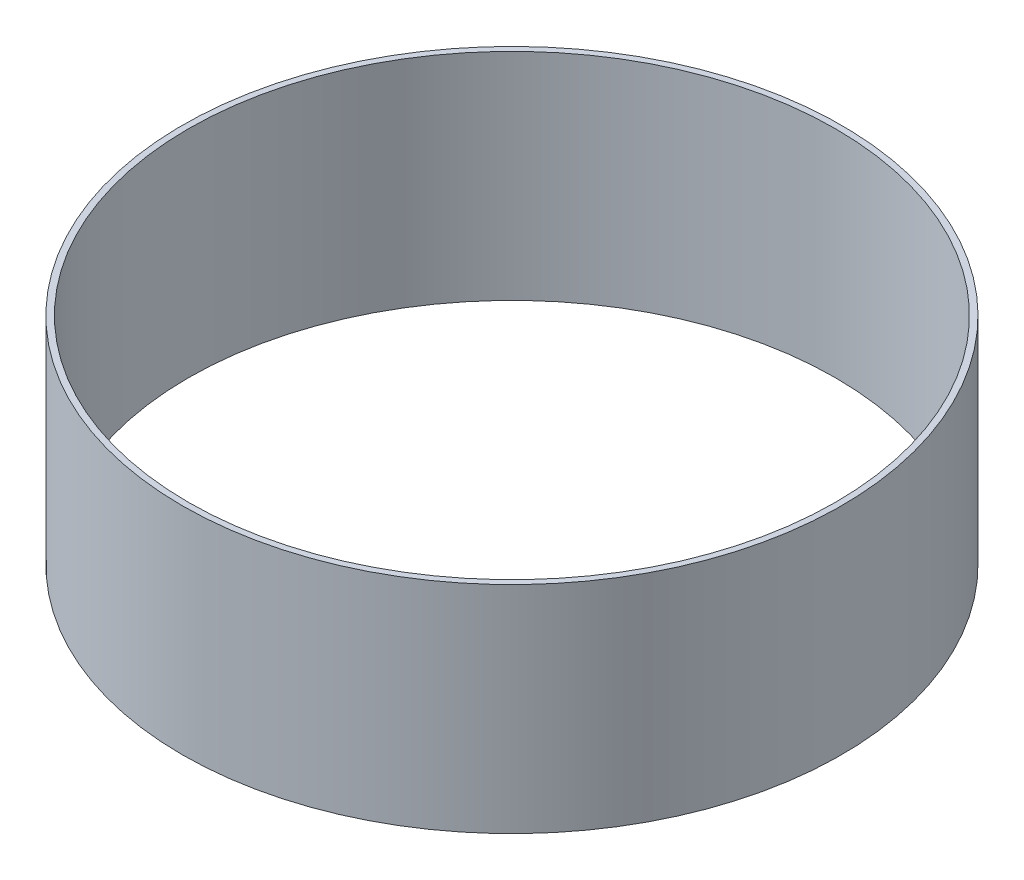
ISO-10303-21;
HEADER;
FILE_DESCRIPTION(('STEP AP214'),'2;1');
FILE_NAME('part.step','',(''),(''),'','','');
FILE_SCHEMA(('AUTOMOTIVE_DESIGN { 1 0 10303 214 1 1 1 1 }'));
ENDSEC;
DATA;
#1=APPLICATION_CONTEXT('core data for automotive mechanical design processes');
#2=APPLICATION_PROTOCOL_DEFINITION('international standard','automotive_design',2000,#1);
#3=PRODUCT_CONTEXT('',#1,'mechanical');
#4=PRODUCT('Part','Part','',(#3));
#5=PRODUCT_RELATED_PRODUCT_CATEGORY('part','',(#4));
#6=PRODUCT_DEFINITION_FORMATION('','',#4);
#7=PRODUCT_DEFINITION_CONTEXT('part definition',#1,'design');
#8=PRODUCT_DEFINITION('design','',#6,#7);
#9=PRODUCT_DEFINITION_SHAPE('','',#8);
#10=(LENGTH_UNIT() NAMED_UNIT(*) SI_UNIT(.MILLI.,.METRE.));
#11=(NAMED_UNIT(*) PLANE_ANGLE_UNIT() SI_UNIT($,.RADIAN.));
#12=(NAMED_UNIT(*) SI_UNIT($,.STERADIAN.) SOLID_ANGLE_UNIT());
#13=UNCERTAINTY_MEASURE_WITH_UNIT(LENGTH_MEASURE(1.E-05),#10,'distance_accuracy_value','');
#14=(GEOMETRIC_REPRESENTATION_CONTEXT(3) GLOBAL_UNCERTAINTY_ASSIGNED_CONTEXT((#13)) GLOBAL_UNIT_ASSIGNED_CONTEXT((#10,
#11,#12)) REPRESENTATION_CONTEXT('',''));
#15=CARTESIAN_POINT('',(0.,0.,0.));
#16=DIRECTION('',(0.,0.,1.));
#17=DIRECTION('',(1.,0.,0.));
#18=AXIS2_PLACEMENT_3D('',#15,#16,#17);
#19=CARTESIAN_POINT('',(0.,25.4,0.));
#20=DIRECTION('',(0.,1.,0.));
#21=DIRECTION('',(0.,0.,1.));
#22=AXIS2_PLACEMENT_3D('',#19,#20,#21);
#23=PLANE('',#22);
#24=CARTESIAN_POINT('',(0.,25.4,0.));
#25=DIRECTION('',(0.,1.,0.));
#26=DIRECTION('',(0.,0.,1.));
#27=AXIS2_PLACEMENT_3D('',#24,#25,#26);
#28=CIRCLE('',#27,77.6224);
#29=CARTESIAN_POINT('',(0.,25.4,77.6224));
#30=VERTEX_POINT('',#29);
#31=EDGE_CURVE('E10',#30,#30,#28,.T.);
#32=ORIENTED_EDGE('',*,*,#31,.T.);
#33=EDGE_LOOP('',(#32));
#34=FACE_BOUND('',#33,.T.);
#35=CARTESIAN_POINT('',(0.,25.4,0.));
#36=DIRECTION('',(0.,1.,0.));
#37=DIRECTION('',(0.,0.,1.));
#38=AXIS2_PLACEMENT_3D('',#35,#36,#37);
#39=CIRCLE('',#38,76.2);
#40=CARTESIAN_POINT('',(0.,25.4,76.2));
#41=VERTEX_POINT('',#40);
#42=EDGE_CURVE('E46',#41,#41,#39,.T.);
#43=ORIENTED_EDGE('',*,*,#42,.F.);
#44=EDGE_LOOP('',(#43));
#45=FACE_BOUND('',#44,.T.);
#46=ADVANCED_FACE('F35',(#34,#45),#23,.T.);
#47=CARTESIAN_POINT('',(0.,-25.4,0.));
#48=DIRECTION('',(0.,1.,0.));
#49=DIRECTION('',(0.,0.,1.));
#50=AXIS2_PLACEMENT_3D('',#47,#48,#49);
#51=PLANE('',#50);
#52=CARTESIAN_POINT('',(0.,-25.4,0.));
#53=DIRECTION('',(0.,1.,0.));
#54=DIRECTION('',(0.,0.,1.));
#55=AXIS2_PLACEMENT_3D('',#52,#53,#54);
#56=CIRCLE('',#55,77.6224);
#57=CARTESIAN_POINT('',(0.,-25.4,77.6224));
#58=VERTEX_POINT('',#57);
#59=EDGE_CURVE('E39',#58,#58,#56,.T.);
#60=ORIENTED_EDGE('',*,*,#59,.F.);
#61=EDGE_LOOP('',(#60));
#62=FACE_BOUND('',#61,.T.);
#63=CARTESIAN_POINT('',(0.,-25.4,0.));
#64=DIRECTION('',(0.,1.,0.));
#65=DIRECTION('',(0.,0.,1.));
#66=AXIS2_PLACEMENT_3D('',#63,#64,#65);
#67=CIRCLE('',#66,76.2);
#68=CARTESIAN_POINT('',(0.,-25.4,76.2));
#69=VERTEX_POINT('',#68);
#70=EDGE_CURVE('E48',#69,#69,#67,.T.);
#71=ORIENTED_EDGE('',*,*,#70,.T.);
#72=EDGE_LOOP('',(#71));
#73=FACE_BOUND('',#72,.T.);
#74=ADVANCED_FACE('F58',(#62,#73),#51,.F.);
#75=CARTESIAN_POINT('',(0.,25.4,0.));
#76=DIRECTION('',(0.,-1.,0.));
#77=DIRECTION('',(0.,0.,-1.));
#78=AXIS2_PLACEMENT_3D('',#75,#76,#77);
#79=CYLINDRICAL_SURFACE('',#78,77.6224);
#80=ORIENTED_EDGE('',*,*,#31,.F.);
#81=EDGE_LOOP('',(#80));
#82=FACE_BOUND('',#81,.T.);
#83=ORIENTED_EDGE('',*,*,#59,.T.);
#84=EDGE_LOOP('',(#83));
#85=FACE_BOUND('',#84,.T.);
#86=ADVANCED_FACE('F37',(#82,#85),#79,.T.);
#87=CARTESIAN_POINT('',(0.,25.4,0.));
#88=DIRECTION('',(0.,-1.,0.));
#89=DIRECTION('',(0.,0.,-1.));
#90=AXIS2_PLACEMENT_3D('',#87,#88,#89);
#91=CYLINDRICAL_SURFACE('',#90,76.2);
#92=ORIENTED_EDGE('',*,*,#42,.T.);
#93=EDGE_LOOP('',(#92));
#94=FACE_BOUND('',#93,.T.);
#95=ORIENTED_EDGE('',*,*,#70,.F.);
#96=EDGE_LOOP('',(#95));
#97=FACE_BOUND('',#96,.T.);
#98=ADVANCED_FACE('F54',(#94,#97),#91,.F.);
#99=CLOSED_SHELL('',(#46,#74,#86,#98));
#100=MANIFOLD_SOLID_BREP('B2',#99);
#101=ADVANCED_BREP_SHAPE_REPRESENTATION('',(#18,#100),#14);
#102=SHAPE_DEFINITION_REPRESENTATION(#9,#101);
ENDSEC;
END-ISO-10303-21;
